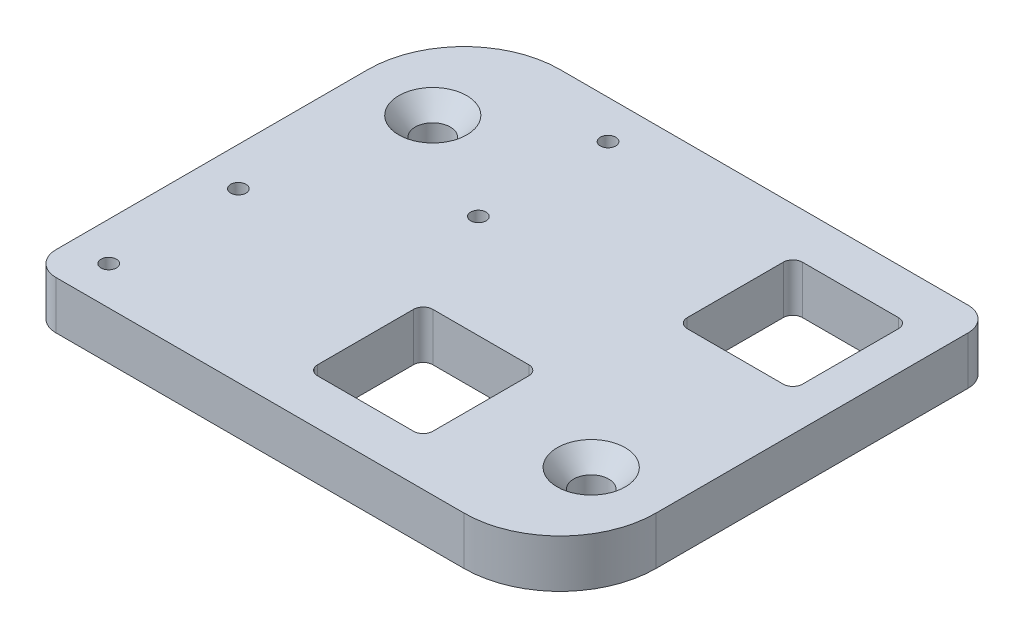
ISO-10303-21;
HEADER;
FILE_DESCRIPTION(('STEP AP214'),'2;1');
FILE_NAME('part.step','',(''),(''),'','','');
FILE_SCHEMA(('AUTOMOTIVE_DESIGN { 1 0 10303 214 1 1 1 1 }'));
ENDSEC;
DATA;
#1=APPLICATION_CONTEXT('core data for automotive mechanical design processes');
#2=APPLICATION_PROTOCOL_DEFINITION('international standard','automotive_design',2000,#1);
#3=PRODUCT_CONTEXT('',#1,'mechanical');
#4=PRODUCT('Part','Part','',(#3));
#5=PRODUCT_RELATED_PRODUCT_CATEGORY('part','',(#4));
#6=PRODUCT_DEFINITION_FORMATION('','',#4);
#7=PRODUCT_DEFINITION_CONTEXT('part definition',#1,'design');
#8=PRODUCT_DEFINITION('design','',#6,#7);
#9=PRODUCT_DEFINITION_SHAPE('','',#8);
#10=(LENGTH_UNIT() NAMED_UNIT(*) SI_UNIT(.MILLI.,.METRE.));
#11=(NAMED_UNIT(*) PLANE_ANGLE_UNIT() SI_UNIT($,.RADIAN.));
#12=(NAMED_UNIT(*) SI_UNIT($,.STERADIAN.) SOLID_ANGLE_UNIT());
#13=UNCERTAINTY_MEASURE_WITH_UNIT(LENGTH_MEASURE(1.E-05),#10,'distance_accuracy_value','');
#14=(GEOMETRIC_REPRESENTATION_CONTEXT(3) GLOBAL_UNCERTAINTY_ASSIGNED_CONTEXT((#13)) GLOBAL_UNIT_ASSIGNED_CONTEXT((#10,
#11,#12)) REPRESENTATION_CONTEXT('',''));
#15=CARTESIAN_POINT('',(0.,0.,0.));
#16=DIRECTION('',(0.,0.,1.));
#17=DIRECTION('',(1.,0.,0.));
#18=AXIS2_PLACEMENT_3D('',#15,#16,#17);
#19=CARTESIAN_POINT('',(-27.5,-5.,-45.));
#20=DIRECTION('',(-1.,0.,0.));
#21=DIRECTION('',(0.,0.,1.));
#22=AXIS2_PLACEMENT_3D('',#19,#20,#21);
#23=PLANE('',#22);
#24=DIRECTION('',(0.,0.,1.));
#25=VECTOR('',#24,1.);
#26=CARTESIAN_POINT('',(-27.5,-5.,-45.));
#27=LINE('',#26,#25);
#28=CARTESIAN_POINT('',(-27.5,-5.,-35.));
#29=VERTEX_POINT('',#28);
#30=CARTESIAN_POINT('',(-27.5,-5.,-2.50000000000002));
#31=VERTEX_POINT('',#30);
#32=EDGE_CURVE('E203',#29,#31,#27,.T.);
#33=ORIENTED_EDGE('',*,*,#32,.T.);
#34=DIRECTION('',(0.,1.,0.));
#35=VECTOR('',#34,1.);
#36=CARTESIAN_POINT('',(-27.5,-5.,-2.5));
#37=LINE('',#36,#35);
#38=CARTESIAN_POINT('',(-27.5,0.,-2.50000000000002));
#39=VERTEX_POINT('',#38);
#40=EDGE_CURVE('E236',#31,#39,#37,.T.);
#41=ORIENTED_EDGE('',*,*,#40,.T.);
#42=DIRECTION('',(0.,0.,1.));
#43=VECTOR('',#42,1.);
#44=CARTESIAN_POINT('',(-27.5,0.,-45.));
#45=LINE('',#44,#43);
#46=CARTESIAN_POINT('',(-27.5,0.,-35.));
#47=VERTEX_POINT('',#46);
#48=EDGE_CURVE('E399',#47,#39,#45,.T.);
#49=ORIENTED_EDGE('',*,*,#48,.F.);
#50=DIRECTION('',(0.,1.,0.));
#51=VECTOR('',#50,1.);
#52=CARTESIAN_POINT('',(-27.5,-5.,-35.));
#53=LINE('',#52,#51);
#54=EDGE_CURVE('E212',#47,#29,#53,.F.);
#55=ORIENTED_EDGE('',*,*,#54,.T.);
#56=EDGE_LOOP('',(#33,#41,#49,#55));
#57=FACE_BOUND('',#56,.T.);
#58=ADVANCED_FACE('F32',(#57),#23,.T.);
#59=CARTESIAN_POINT('',(-27.5,-5.,-45.));
#60=DIRECTION('',(0.,0.,-1.));
#61=DIRECTION('',(-1.,0.,0.));
#62=AXIS2_PLACEMENT_3D('',#59,#60,#61);
#63=PLANE('',#62);
#64=DIRECTION('',(-1.,0.,0.));
#65=VECTOR('',#64,1.);
#66=CARTESIAN_POINT('',(-27.5,0.,-45.));
#67=LINE('',#66,#65);
#68=CARTESIAN_POINT('',(25.,0.,-45.));
#69=VERTEX_POINT('',#68);
#70=CARTESIAN_POINT('',(-17.5,0.,-45.));
#71=VERTEX_POINT('',#70);
#72=EDGE_CURVE('E192',#69,#71,#67,.T.);
#73=ORIENTED_EDGE('',*,*,#72,.F.);
#74=DIRECTION('',(0.,1.,0.));
#75=VECTOR('',#74,1.);
#76=CARTESIAN_POINT('',(25.,-5.,-45.));
#77=LINE('',#76,#75);
#78=CARTESIAN_POINT('',(25.,-5.,-45.));
#79=VERTEX_POINT('',#78);
#80=EDGE_CURVE('E251',#69,#79,#77,.F.);
#81=ORIENTED_EDGE('',*,*,#80,.T.);
#82=DIRECTION('',(-1.,0.,0.));
#83=VECTOR('',#82,1.);
#84=CARTESIAN_POINT('',(-27.5,-5.,-45.));
#85=LINE('',#84,#83);
#86=CARTESIAN_POINT('',(-17.5,-5.,-45.));
#87=VERTEX_POINT('',#86);
#88=EDGE_CURVE('E217',#79,#87,#85,.T.);
#89=ORIENTED_EDGE('',*,*,#88,.T.);
#90=DIRECTION('',(0.,1.,0.));
#91=VECTOR('',#90,1.);
#92=CARTESIAN_POINT('',(-17.5,-5.,-45.));
#93=LINE('',#92,#91);
#94=EDGE_CURVE('E211',#87,#71,#93,.T.);
#95=ORIENTED_EDGE('',*,*,#94,.T.);
#96=EDGE_LOOP('',(#73,#81,#89,#95));
#97=FACE_BOUND('',#96,.T.);
#98=ADVANCED_FACE('F215',(#97),#63,.T.);
#99=CARTESIAN_POINT('',(27.5,-5.,-45.));
#100=DIRECTION('',(1.,0.,0.));
#101=DIRECTION('',(0.,0.,-1.));
#102=AXIS2_PLACEMENT_3D('',#99,#100,#101);
#103=PLANE('',#102);
#104=DIRECTION('',(0.,0.,-1.));
#105=VECTOR('',#104,1.);
#106=CARTESIAN_POINT('',(27.5,-5.,-45.));
#107=LINE('',#106,#105);
#108=CARTESIAN_POINT('',(27.5,-5.,-10.));
#109=VERTEX_POINT('',#108);
#110=CARTESIAN_POINT('',(27.5,-5.,-42.5));
#111=VERTEX_POINT('',#110);
#112=EDGE_CURVE('E221',#109,#111,#107,.T.);
#113=ORIENTED_EDGE('',*,*,#112,.T.);
#114=DIRECTION('',(0.,1.,0.));
#115=VECTOR('',#114,1.);
#116=CARTESIAN_POINT('',(27.5,-5.,-42.5));
#117=LINE('',#116,#115);
#118=CARTESIAN_POINT('',(27.5,0.,-42.5));
#119=VERTEX_POINT('',#118);
#120=EDGE_CURVE('E248',#111,#119,#117,.T.);
#121=ORIENTED_EDGE('',*,*,#120,.T.);
#122=DIRECTION('',(0.,0.,-1.));
#123=VECTOR('',#122,1.);
#124=CARTESIAN_POINT('',(27.5,0.,-45.));
#125=LINE('',#124,#123);
#126=CARTESIAN_POINT('',(27.5,0.,-10.));
#127=VERTEX_POINT('',#126);
#128=EDGE_CURVE('E204',#127,#119,#125,.T.);
#129=ORIENTED_EDGE('',*,*,#128,.F.);
#130=DIRECTION('',(0.,1.,0.));
#131=VECTOR('',#130,1.);
#132=CARTESIAN_POINT('',(27.5,-5.,-9.99999999999999));
#133=LINE('',#132,#131);
#134=EDGE_CURVE('E234',#127,#109,#133,.F.);
#135=ORIENTED_EDGE('',*,*,#134,.T.);
#136=EDGE_LOOP('',(#113,#121,#129,#135));
#137=FACE_BOUND('',#136,.T.);
#138=ADVANCED_FACE('F412',(#137),#103,.T.);
#139=CARTESIAN_POINT('',(-27.5,-5.,0.));
#140=DIRECTION('',(0.,0.,1.));
#141=DIRECTION('',(1.,0.,0.));
#142=AXIS2_PLACEMENT_3D('',#139,#140,#141);
#143=PLANE('',#142);
#144=DIRECTION('',(1.,0.,0.));
#145=VECTOR('',#144,1.);
#146=CARTESIAN_POINT('',(-27.5,0.,0.));
#147=LINE('',#146,#145);
#148=CARTESIAN_POINT('',(-25.,0.,0.));
#149=VERTEX_POINT('',#148);
#150=CARTESIAN_POINT('',(17.5,0.,0.));
#151=VERTEX_POINT('',#150);
#152=EDGE_CURVE('E407',#149,#151,#147,.T.);
#153=ORIENTED_EDGE('',*,*,#152,.F.);
#154=DIRECTION('',(0.,1.,0.));
#155=VECTOR('',#154,1.);
#156=CARTESIAN_POINT('',(-25.,-5.,0.));
#157=LINE('',#156,#155);
#158=CARTESIAN_POINT('',(-25.,-5.,0.));
#159=VERTEX_POINT('',#158);
#160=EDGE_CURVE('E242',#149,#159,#157,.F.);
#161=ORIENTED_EDGE('',*,*,#160,.T.);
#162=DIRECTION('',(1.,0.,0.));
#163=VECTOR('',#162,1.);
#164=CARTESIAN_POINT('',(-27.5,-5.,0.));
#165=LINE('',#164,#163);
#166=CARTESIAN_POINT('',(17.5,-5.,0.));
#167=VERTEX_POINT('',#166);
#168=EDGE_CURVE('E402',#159,#167,#165,.T.);
#169=ORIENTED_EDGE('',*,*,#168,.T.);
#170=DIRECTION('',(0.,1.,0.));
#171=VECTOR('',#170,1.);
#172=CARTESIAN_POINT('',(17.5,-5.,0.));
#173=LINE('',#172,#171);
#174=EDGE_CURVE('E231',#167,#151,#173,.T.);
#175=ORIENTED_EDGE('',*,*,#174,.T.);
#176=EDGE_LOOP('',(#153,#161,#169,#175));
#177=FACE_BOUND('',#176,.T.);
#178=ADVANCED_FACE('F434',(#177),#143,.T.);
#179=CARTESIAN_POINT('',(0.,-5.,0.));
#180=DIRECTION('',(0.,1.,0.));
#181=DIRECTION('',(0.,0.,1.));
#182=AXIS2_PLACEMENT_3D('',#179,#180,#181);
#183=PLANE('',#182);
#184=DIRECTION('',(0.,0.,-1.));
#185=VECTOR('',#184,1.);
#186=CARTESIAN_POINT('',(8.49999999999999,-5.,-16.75));
#187=LINE('',#186,#185);
#188=CARTESIAN_POINT('',(8.49999999999999,-5.,-5.75000000000001));
#189=VERTEX_POINT('',#188);
#190=CARTESIAN_POINT('',(8.49999999999999,-5.,-15.75));
#191=VERTEX_POINT('',#190);
#192=EDGE_CURVE('E511',#189,#191,#187,.T.);
#193=ORIENTED_EDGE('',*,*,#192,.T.);
#194=CARTESIAN_POINT('',(7.49999999999999,-5.,-15.75));
#195=DIRECTION('',(0.,1.,0.));
#196=DIRECTION('',(0.,0.,1.));
#197=AXIS2_PLACEMENT_3D('',#194,#195,#196);
#198=CIRCLE('',#197,1.);
#199=CARTESIAN_POINT('',(7.49999999999999,-5.,-16.75));
#200=VERTEX_POINT('',#199);
#201=EDGE_CURVE('E294',#191,#200,#198,.T.);
#202=ORIENTED_EDGE('',*,*,#201,.T.);
#203=DIRECTION('',(-1.,0.,0.));
#204=VECTOR('',#203,1.);
#205=CARTESIAN_POINT('',(-3.50000000000001,-5.,-16.75));
#206=LINE('',#205,#204);
#207=CARTESIAN_POINT('',(-2.50000000000001,-5.,-16.75));
#208=VERTEX_POINT('',#207);
#209=EDGE_CURVE('E360',#200,#208,#206,.T.);
#210=ORIENTED_EDGE('',*,*,#209,.T.);
#211=CARTESIAN_POINT('',(-2.50000000000001,-5.,-15.75));
#212=DIRECTION('',(0.,1.,0.));
#213=DIRECTION('',(0.,0.,1.));
#214=AXIS2_PLACEMENT_3D('',#211,#212,#213);
#215=CIRCLE('',#214,1.);
#216=CARTESIAN_POINT('',(-3.50000000000001,-5.,-15.75));
#217=VERTEX_POINT('',#216);
#218=EDGE_CURVE('E298',#208,#217,#215,.T.);
#219=ORIENTED_EDGE('',*,*,#218,.T.);
#220=DIRECTION('',(0.,0.,1.));
#221=VECTOR('',#220,1.);
#222=CARTESIAN_POINT('',(-3.50000000000001,-5.,-16.75));
#223=LINE('',#222,#221);
#224=CARTESIAN_POINT('',(-3.50000000000001,-5.,-5.75000000000001));
#225=VERTEX_POINT('',#224);
#226=EDGE_CURVE('E503',#217,#225,#223,.T.);
#227=ORIENTED_EDGE('',*,*,#226,.T.);
#228=CARTESIAN_POINT('',(-2.50000000000001,-5.,-5.75000000000001));
#229=DIRECTION('',(0.,1.,0.));
#230=DIRECTION('',(0.,0.,1.));
#231=AXIS2_PLACEMENT_3D('',#228,#229,#230);
#232=CIRCLE('',#231,1.);
#233=CARTESIAN_POINT('',(-2.50000000000001,-5.,-4.75000000000001));
#234=VERTEX_POINT('',#233);
#235=EDGE_CURVE('E302',#225,#234,#232,.T.);
#236=ORIENTED_EDGE('',*,*,#235,.T.);
#237=DIRECTION('',(1.,0.,0.));
#238=VECTOR('',#237,1.);
#239=CARTESIAN_POINT('',(-3.50000000000001,-5.,-4.75000000000001));
#240=LINE('',#239,#238);
#241=CARTESIAN_POINT('',(7.49999999999999,-5.,-4.75000000000001));
#242=VERTEX_POINT('',#241);
#243=EDGE_CURVE('E514',#234,#242,#240,.T.);
#244=ORIENTED_EDGE('',*,*,#243,.T.);
#245=CARTESIAN_POINT('',(7.49999999999999,-5.,-5.75000000000001));
#246=DIRECTION('',(0.,1.,0.));
#247=DIRECTION('',(0.,0.,1.));
#248=AXIS2_PLACEMENT_3D('',#245,#246,#247);
#249=CIRCLE('',#248,1.);
#250=EDGE_CURVE('E306',#242,#189,#249,.T.);
#251=ORIENTED_EDGE('',*,*,#250,.T.);
#252=EDGE_LOOP('',(#193,#202,#210,#219,#227,#236,#244,#251));
#253=FACE_BOUND('',#252,.T.);
#254=DIRECTION('',(0.,0.,-1.));
#255=VECTOR('',#254,1.);
#256=CARTESIAN_POINT('',(23.5,-5.,-40.25));
#257=LINE('',#256,#255);
#258=CARTESIAN_POINT('',(23.5,-5.,-29.25));
#259=VERTEX_POINT('',#258);
#260=CARTESIAN_POINT('',(23.5,-5.,-39.25));
#261=VERTEX_POINT('',#260);
#262=EDGE_CURVE('E340',#259,#261,#257,.T.);
#263=ORIENTED_EDGE('',*,*,#262,.T.);
#264=CARTESIAN_POINT('',(22.5,-5.,-39.25));
#265=DIRECTION('',(0.,1.,0.));
#266=DIRECTION('',(0.,0.,1.));
#267=AXIS2_PLACEMENT_3D('',#264,#265,#266);
#268=CIRCLE('',#267,1.);
#269=CARTESIAN_POINT('',(22.5,-5.,-40.25));
#270=VERTEX_POINT('',#269);
#271=EDGE_CURVE('E11',#261,#270,#268,.T.);
#272=ORIENTED_EDGE('',*,*,#271,.T.);
#273=DIRECTION('',(-1.,0.,0.));
#274=VECTOR('',#273,1.);
#275=CARTESIAN_POINT('',(11.5,-5.,-40.25));
#276=LINE('',#275,#274);
#277=CARTESIAN_POINT('',(12.5,-5.,-40.25));
#278=VERTEX_POINT('',#277);
#279=EDGE_CURVE('E337',#270,#278,#276,.T.);
#280=ORIENTED_EDGE('',*,*,#279,.T.);
#281=CARTESIAN_POINT('',(12.5,-5.,-39.25));
#282=DIRECTION('',(0.,1.,0.));
#283=DIRECTION('',(0.,0.,1.));
#284=AXIS2_PLACEMENT_3D('',#281,#282,#283);
#285=CIRCLE('',#284,1.);
#286=CARTESIAN_POINT('',(11.5,-5.,-39.25));
#287=VERTEX_POINT('',#286);
#288=EDGE_CURVE('E318',#278,#287,#285,.T.);
#289=ORIENTED_EDGE('',*,*,#288,.T.);
#290=DIRECTION('',(0.,0.,1.));
#291=VECTOR('',#290,1.);
#292=CARTESIAN_POINT('',(11.5,-5.,-40.25));
#293=LINE('',#292,#291);
#294=CARTESIAN_POINT('',(11.5,-5.,-29.25));
#295=VERTEX_POINT('',#294);
#296=EDGE_CURVE('E355',#287,#295,#293,.T.);
#297=ORIENTED_EDGE('',*,*,#296,.T.);
#298=CARTESIAN_POINT('',(12.5,-5.,-29.25));
#299=DIRECTION('',(0.,1.,0.));
#300=DIRECTION('',(0.,0.,1.));
#301=AXIS2_PLACEMENT_3D('',#298,#299,#300);
#302=CIRCLE('',#301,1.);
#303=CARTESIAN_POINT('',(12.5,-5.,-28.25));
#304=VERTEX_POINT('',#303);
#305=EDGE_CURVE('E314',#295,#304,#302,.T.);
#306=ORIENTED_EDGE('',*,*,#305,.T.);
#307=DIRECTION('',(1.,0.,0.));
#308=VECTOR('',#307,1.);
#309=CARTESIAN_POINT('',(11.5,-5.,-28.25));
#310=LINE('',#309,#308);
#311=CARTESIAN_POINT('',(22.5,-5.,-28.25));
#312=VERTEX_POINT('',#311);
#313=EDGE_CURVE('E345',#304,#312,#310,.T.);
#314=ORIENTED_EDGE('',*,*,#313,.T.);
#315=CARTESIAN_POINT('',(22.5,-5.,-29.25));
#316=DIRECTION('',(0.,1.,0.));
#317=DIRECTION('',(0.,0.,1.));
#318=AXIS2_PLACEMENT_3D('',#315,#316,#317);
#319=CIRCLE('',#318,1.);
#320=EDGE_CURVE('E310',#312,#259,#319,.T.);
#321=ORIENTED_EDGE('',*,*,#320,.T.);
#322=EDGE_LOOP('',(#263,#272,#280,#289,#297,#306,#314,#321));
#323=FACE_BOUND('',#322,.T.);
#324=CARTESIAN_POINT('',(-20.,-5.,-34.25));
#325=DIRECTION('',(0.,1.,0.));
#326=DIRECTION('',(0.,0.,1.));
#327=AXIS2_PLACEMENT_3D('',#324,#325,#326);
#328=CIRCLE('',#327,1.8288);
#329=CARTESIAN_POINT('',(-20.,-5.,-32.4212));
#330=VERTEX_POINT('',#329);
#331=EDGE_CURVE('E363',#330,#330,#328,.T.);
#332=ORIENTED_EDGE('',*,*,#331,.T.);
#333=EDGE_LOOP('',(#332));
#334=FACE_BOUND('',#333,.T.);
#335=CARTESIAN_POINT('',(20.,-5.,-10.75));
#336=DIRECTION('',(0.,1.,0.));
#337=DIRECTION('',(0.,0.,1.));
#338=AXIS2_PLACEMENT_3D('',#335,#336,#337);
#339=CIRCLE('',#338,1.8288);
#340=CARTESIAN_POINT('',(20.,-5.,-8.9212));
#341=VERTEX_POINT('',#340);
#342=EDGE_CURVE('E372',#341,#341,#339,.T.);
#343=ORIENTED_EDGE('',*,*,#342,.T.);
#344=EDGE_LOOP('',(#343));
#345=FACE_BOUND('',#344,.T.);
#346=CARTESIAN_POINT('',(-23.5,-5.,-4.));
#347=DIRECTION('',(0.,1.,0.));
#348=DIRECTION('',(0.,0.,1.));
#349=AXIS2_PLACEMENT_3D('',#346,#347,#348);
#350=CIRCLE('',#349,0.799999999999999);
#351=CARTESIAN_POINT('',(-23.5,-5.,-3.2));
#352=VERTEX_POINT('',#351);
#353=EDGE_CURVE('E378',#352,#352,#350,.T.);
#354=ORIENTED_EDGE('',*,*,#353,.T.);
#355=EDGE_LOOP('',(#354));
#356=FACE_BOUND('',#355,.T.);
#357=CARTESIAN_POINT('',(-23.5,-5.,-17.5));
#358=DIRECTION('',(0.,1.,0.));
#359=DIRECTION('',(0.,0.,1.));
#360=AXIS2_PLACEMENT_3D('',#357,#358,#359);
#361=CIRCLE('',#360,0.799999999999999);
#362=CARTESIAN_POINT('',(-23.5,-5.,-16.7));
#363=VERTEX_POINT('',#362);
#364=EDGE_CURVE('E384',#363,#363,#361,.T.);
#365=ORIENTED_EDGE('',*,*,#364,.T.);
#366=EDGE_LOOP('',(#365));
#367=FACE_BOUND('',#366,.T.);
#368=CARTESIAN_POINT('',(-8.5,-5.,-27.5));
#369=DIRECTION('',(0.,1.,0.));
#370=DIRECTION('',(0.,0.,1.));
#371=AXIS2_PLACEMENT_3D('',#368,#369,#370);
#372=CIRCLE('',#371,0.799999999999999);
#373=CARTESIAN_POINT('',(-8.5,-5.,-26.7));
#374=VERTEX_POINT('',#373);
#375=EDGE_CURVE('E390',#374,#374,#372,.T.);
#376=ORIENTED_EDGE('',*,*,#375,.T.);
#377=EDGE_LOOP('',(#376));
#378=FACE_BOUND('',#377,.T.);
#379=CARTESIAN_POINT('',(-8.5,-5.,-41.));
#380=DIRECTION('',(0.,1.,0.));
#381=DIRECTION('',(0.,0.,1.));
#382=AXIS2_PLACEMENT_3D('',#379,#380,#381);
#383=CIRCLE('',#382,0.799999999999999);
#384=CARTESIAN_POINT('',(-8.5,-5.,-40.2));
#385=VERTEX_POINT('',#384);
#386=EDGE_CURVE('E396',#385,#385,#383,.T.);
#387=ORIENTED_EDGE('',*,*,#386,.T.);
#388=EDGE_LOOP('',(#387));
#389=FACE_BOUND('',#388,.T.);
#390=ORIENTED_EDGE('',*,*,#168,.F.);
#391=CARTESIAN_POINT('',(-25.,-5.,-2.5));
#392=DIRECTION('',(0.,1.,0.));
#393=DIRECTION('',(0.,0.,1.));
#394=AXIS2_PLACEMENT_3D('',#391,#392,#393);
#395=CIRCLE('',#394,2.5);
#396=EDGE_CURVE('E246',#159,#31,#395,.F.);
#397=ORIENTED_EDGE('',*,*,#396,.T.);
#398=ORIENTED_EDGE('',*,*,#32,.F.);
#399=CARTESIAN_POINT('',(-17.5,-5.,-35.));
#400=DIRECTION('',(0.,1.,0.));
#401=DIRECTION('',(0.,0.,1.));
#402=AXIS2_PLACEMENT_3D('',#399,#400,#401);
#403=CIRCLE('',#402,10.);
#404=EDGE_CURVE('E229',#29,#87,#403,.F.);
#405=ORIENTED_EDGE('',*,*,#404,.T.);
#406=ORIENTED_EDGE('',*,*,#88,.F.);
#407=CARTESIAN_POINT('',(25.,-5.,-42.5));
#408=DIRECTION('',(0.,1.,0.));
#409=DIRECTION('',(0.,0.,1.));
#410=AXIS2_PLACEMENT_3D('',#407,#408,#409);
#411=CIRCLE('',#410,2.5);
#412=EDGE_CURVE('E244',#79,#111,#411,.F.);
#413=ORIENTED_EDGE('',*,*,#412,.T.);
#414=ORIENTED_EDGE('',*,*,#112,.F.);
#415=CARTESIAN_POINT('',(17.5,-5.,-10.));
#416=DIRECTION('',(0.,1.,0.));
#417=DIRECTION('',(0.,0.,1.));
#418=AXIS2_PLACEMENT_3D('',#415,#416,#417);
#419=CIRCLE('',#418,10.);
#420=EDGE_CURVE('E226',#109,#167,#419,.F.);
#421=ORIENTED_EDGE('',*,*,#420,.T.);
#422=EDGE_LOOP('',(#390,#397,#398,#405,#406,#413,#414,#421));
#423=FACE_BOUND('',#422,.T.);
#424=ADVANCED_FACE('F421',(#253,#323,#334,#345,#356,#367,#378,#389,#423),#183,.F.);
#425=CARTESIAN_POINT('',(0.,0.,0.));
#426=DIRECTION('',(0.,1.,0.));
#427=DIRECTION('',(0.,0.,1.));
#428=AXIS2_PLACEMENT_3D('',#425,#426,#427);
#429=PLANE('',#428);
#430=DIRECTION('',(0.,0.,1.));
#431=VECTOR('',#430,1.);
#432=CARTESIAN_POINT('',(-3.50000000000001,0.,-16.75));
#433=LINE('',#432,#431);
#434=CARTESIAN_POINT('',(-3.50000000000001,0.,-15.75));
#435=VERTEX_POINT('',#434);
#436=CARTESIAN_POINT('',(-3.50000000000001,0.,-5.75000000000001));
#437=VERTEX_POINT('',#436);
#438=EDGE_CURVE('E339',#435,#437,#433,.T.);
#439=ORIENTED_EDGE('',*,*,#438,.F.);
#440=CARTESIAN_POINT('',(-2.50000000000001,0.,-15.75));
#441=DIRECTION('',(0.,1.,0.));
#442=DIRECTION('',(0.,0.,1.));
#443=AXIS2_PLACEMENT_3D('',#440,#441,#442);
#444=CIRCLE('',#443,1.);
#445=CARTESIAN_POINT('',(-2.50000000000001,0.,-16.75));
#446=VERTEX_POINT('',#445);
#447=EDGE_CURVE('E296',#435,#446,#444,.F.);
#448=ORIENTED_EDGE('',*,*,#447,.T.);
#449=DIRECTION('',(-1.,0.,0.));
#450=VECTOR('',#449,1.);
#451=CARTESIAN_POINT('',(-3.50000000000001,0.,-16.75));
#452=LINE('',#451,#450);
#453=CARTESIAN_POINT('',(7.49999999999999,0.,-16.75));
#454=VERTEX_POINT('',#453);
#455=EDGE_CURVE('E500',#454,#446,#452,.T.);
#456=ORIENTED_EDGE('',*,*,#455,.F.);
#457=CARTESIAN_POINT('',(7.49999999999999,0.,-15.75));
#458=DIRECTION('',(0.,1.,0.));
#459=DIRECTION('',(0.,0.,1.));
#460=AXIS2_PLACEMENT_3D('',#457,#458,#459);
#461=CIRCLE('',#460,1.);
#462=CARTESIAN_POINT('',(8.49999999999999,0.,-15.75));
#463=VERTEX_POINT('',#462);
#464=EDGE_CURVE('E292',#454,#463,#461,.F.);
#465=ORIENTED_EDGE('',*,*,#464,.T.);
#466=DIRECTION('',(0.,0.,-1.));
#467=VECTOR('',#466,1.);
#468=CARTESIAN_POINT('',(8.49999999999999,0.,-16.75));
#469=LINE('',#468,#467);
#470=CARTESIAN_POINT('',(8.49999999999999,0.,-5.75000000000001));
#471=VERTEX_POINT('',#470);
#472=EDGE_CURVE('E504',#471,#463,#469,.T.);
#473=ORIENTED_EDGE('',*,*,#472,.F.);
#474=CARTESIAN_POINT('',(7.49999999999999,0.,-5.75000000000001));
#475=DIRECTION('',(0.,1.,0.));
#476=DIRECTION('',(0.,0.,1.));
#477=AXIS2_PLACEMENT_3D('',#474,#475,#476);
#478=CIRCLE('',#477,1.);
#479=CARTESIAN_POINT('',(7.49999999999999,0.,-4.75000000000001));
#480=VERTEX_POINT('',#479);
#481=EDGE_CURVE('E304',#471,#480,#478,.F.);
#482=ORIENTED_EDGE('',*,*,#481,.T.);
#483=DIRECTION('',(1.,0.,0.));
#484=VECTOR('',#483,1.);
#485=CARTESIAN_POINT('',(-3.50000000000001,0.,-4.75000000000001));
#486=LINE('',#485,#484);
#487=CARTESIAN_POINT('',(-2.50000000000001,0.,-4.75000000000001));
#488=VERTEX_POINT('',#487);
#489=EDGE_CURVE('E343',#488,#480,#486,.T.);
#490=ORIENTED_EDGE('',*,*,#489,.F.);
#491=CARTESIAN_POINT('',(-2.50000000000001,0.,-5.75000000000001));
#492=DIRECTION('',(0.,1.,0.));
#493=DIRECTION('',(0.,0.,1.));
#494=AXIS2_PLACEMENT_3D('',#491,#492,#493);
#495=CIRCLE('',#494,1.);
#496=EDGE_CURVE('E300',#488,#437,#495,.F.);
#497=ORIENTED_EDGE('',*,*,#496,.T.);
#498=EDGE_LOOP('',(#439,#448,#456,#465,#473,#482,#490,#497));
#499=FACE_BOUND('',#498,.T.);
#500=DIRECTION('',(0.,0.,1.));
#501=VECTOR('',#500,1.);
#502=CARTESIAN_POINT('',(11.5,0.,-40.25));
#503=LINE('',#502,#501);
#504=CARTESIAN_POINT('',(11.5,0.,-39.25));
#505=VERTEX_POINT('',#504);
#506=CARTESIAN_POINT('',(11.5,0.,-29.25));
#507=VERTEX_POINT('',#506);
#508=EDGE_CURVE('E349',#505,#507,#503,.T.);
#509=ORIENTED_EDGE('',*,*,#508,.F.);
#510=CARTESIAN_POINT('',(12.5,0.,-39.25));
#511=DIRECTION('',(0.,1.,0.));
#512=DIRECTION('',(0.,0.,1.));
#513=AXIS2_PLACEMENT_3D('',#510,#511,#512);
#514=CIRCLE('',#513,1.);
#515=CARTESIAN_POINT('',(12.5,0.,-40.25));
#516=VERTEX_POINT('',#515);
#517=EDGE_CURVE('E316',#505,#516,#514,.F.);
#518=ORIENTED_EDGE('',*,*,#517,.T.);
#519=DIRECTION('',(-1.,0.,0.));
#520=VECTOR('',#519,1.);
#521=CARTESIAN_POINT('',(11.5,0.,-40.25));
#522=LINE('',#521,#520);
#523=CARTESIAN_POINT('',(22.5,0.,-40.25));
#524=VERTEX_POINT('',#523);
#525=EDGE_CURVE('E326',#524,#516,#522,.T.);
#526=ORIENTED_EDGE('',*,*,#525,.F.);
#527=CARTESIAN_POINT('',(22.5,0.,-39.25));
#528=DIRECTION('',(0.,1.,0.));
#529=DIRECTION('',(0.,0.,1.));
#530=AXIS2_PLACEMENT_3D('',#527,#528,#529);
#531=CIRCLE('',#530,1.);
#532=CARTESIAN_POINT('',(23.5,0.,-39.25));
#533=VERTEX_POINT('',#532);
#534=EDGE_CURVE('E40',#524,#533,#531,.F.);
#535=ORIENTED_EDGE('',*,*,#534,.T.);
#536=DIRECTION('',(0.,0.,-1.));
#537=VECTOR('',#536,1.);
#538=CARTESIAN_POINT('',(23.5,0.,-40.25));
#539=LINE('',#538,#537);
#540=CARTESIAN_POINT('',(23.5,0.,-29.25));
#541=VERTEX_POINT('',#540);
#542=EDGE_CURVE('E325',#541,#533,#539,.T.);
#543=ORIENTED_EDGE('',*,*,#542,.F.);
#544=CARTESIAN_POINT('',(22.5,0.,-29.25));
#545=DIRECTION('',(0.,1.,0.));
#546=DIRECTION('',(0.,0.,1.));
#547=AXIS2_PLACEMENT_3D('',#544,#545,#546);
#548=CIRCLE('',#547,1.);
#549=CARTESIAN_POINT('',(22.5,0.,-28.25));
#550=VERTEX_POINT('',#549);
#551=EDGE_CURVE('E308',#541,#550,#548,.F.);
#552=ORIENTED_EDGE('',*,*,#551,.T.);
#553=DIRECTION('',(1.,0.,0.));
#554=VECTOR('',#553,1.);
#555=CARTESIAN_POINT('',(11.5,0.,-28.25));
#556=LINE('',#555,#554);
#557=CARTESIAN_POINT('',(12.5,0.,-28.25));
#558=VERTEX_POINT('',#557);
#559=EDGE_CURVE('E334',#558,#550,#556,.T.);
#560=ORIENTED_EDGE('',*,*,#559,.F.);
#561=CARTESIAN_POINT('',(12.5,0.,-29.25));
#562=DIRECTION('',(0.,1.,0.));
#563=DIRECTION('',(0.,0.,1.));
#564=AXIS2_PLACEMENT_3D('',#561,#562,#563);
#565=CIRCLE('',#564,1.);
#566=EDGE_CURVE('E312',#558,#507,#565,.F.);
#567=ORIENTED_EDGE('',*,*,#566,.T.);
#568=EDGE_LOOP('',(#509,#518,#526,#535,#543,#552,#560,#567));
#569=FACE_BOUND('',#568,.T.);
#570=CARTESIAN_POINT('',(-20.,0.,-34.25));
#571=DIRECTION('',(0.,1.,0.));
#572=DIRECTION('',(0.,0.,1.));
#573=AXIS2_PLACEMENT_3D('',#570,#571,#572);
#574=CIRCLE('',#573,3.5433);
#575=CARTESIAN_POINT('',(-20.,0.,-30.7067));
#576=VERTEX_POINT('',#575);
#577=EDGE_CURVE('E356',#576,#576,#574,.T.);
#578=ORIENTED_EDGE('',*,*,#577,.F.);
#579=EDGE_LOOP('',(#578));
#580=FACE_BOUND('',#579,.T.);
#581=CARTESIAN_POINT('',(20.,0.,-10.75));
#582=DIRECTION('',(0.,1.,0.));
#583=DIRECTION('',(0.,0.,1.));
#584=AXIS2_PLACEMENT_3D('',#581,#582,#583);
#585=CIRCLE('',#584,3.5433);
#586=CARTESIAN_POINT('',(20.,0.,-7.2067));
#587=VERTEX_POINT('',#586);
#588=EDGE_CURVE('E366',#587,#587,#585,.T.);
#589=ORIENTED_EDGE('',*,*,#588,.F.);
#590=EDGE_LOOP('',(#589));
#591=FACE_BOUND('',#590,.T.);
#592=CARTESIAN_POINT('',(-23.5,0.,-4.));
#593=DIRECTION('',(0.,1.,0.));
#594=DIRECTION('',(0.,0.,1.));
#595=AXIS2_PLACEMENT_3D('',#592,#593,#594);
#596=CIRCLE('',#595,0.799999999999999);
#597=CARTESIAN_POINT('',(-23.5,0.,-3.2));
#598=VERTEX_POINT('',#597);
#599=EDGE_CURVE('E375',#598,#598,#596,.T.);
#600=ORIENTED_EDGE('',*,*,#599,.F.);
#601=EDGE_LOOP('',(#600));
#602=FACE_BOUND('',#601,.T.);
#603=CARTESIAN_POINT('',(-23.5,0.,-17.5));
#604=DIRECTION('',(0.,1.,0.));
#605=DIRECTION('',(0.,0.,1.));
#606=AXIS2_PLACEMENT_3D('',#603,#604,#605);
#607=CIRCLE('',#606,0.799999999999999);
#608=CARTESIAN_POINT('',(-23.5,0.,-16.7));
#609=VERTEX_POINT('',#608);
#610=EDGE_CURVE('E381',#609,#609,#607,.T.);
#611=ORIENTED_EDGE('',*,*,#610,.F.);
#612=EDGE_LOOP('',(#611));
#613=FACE_BOUND('',#612,.T.);
#614=CARTESIAN_POINT('',(-8.5,0.,-27.5));
#615=DIRECTION('',(0.,1.,0.));
#616=DIRECTION('',(0.,0.,1.));
#617=AXIS2_PLACEMENT_3D('',#614,#615,#616);
#618=CIRCLE('',#617,0.799999999999999);
#619=CARTESIAN_POINT('',(-8.5,0.,-26.7));
#620=VERTEX_POINT('',#619);
#621=EDGE_CURVE('E387',#620,#620,#618,.T.);
#622=ORIENTED_EDGE('',*,*,#621,.F.);
#623=EDGE_LOOP('',(#622));
#624=FACE_BOUND('',#623,.T.);
#625=CARTESIAN_POINT('',(-8.5,0.,-41.));
#626=DIRECTION('',(0.,1.,0.));
#627=DIRECTION('',(0.,0.,1.));
#628=AXIS2_PLACEMENT_3D('',#625,#626,#627);
#629=CIRCLE('',#628,0.799999999999999);
#630=CARTESIAN_POINT('',(-8.5,0.,-40.2));
#631=VERTEX_POINT('',#630);
#632=EDGE_CURVE('E393',#631,#631,#629,.T.);
#633=ORIENTED_EDGE('',*,*,#632,.F.);
#634=EDGE_LOOP('',(#633));
#635=FACE_BOUND('',#634,.T.);
#636=ORIENTED_EDGE('',*,*,#48,.T.);
#637=CARTESIAN_POINT('',(-25.,0.,-2.5));
#638=DIRECTION('',(0.,1.,0.));
#639=DIRECTION('',(0.,0.,1.));
#640=AXIS2_PLACEMENT_3D('',#637,#638,#639);
#641=CIRCLE('',#640,2.5);
#642=EDGE_CURVE('E240',#39,#149,#641,.T.);
#643=ORIENTED_EDGE('',*,*,#642,.T.);
#644=ORIENTED_EDGE('',*,*,#152,.T.);
#645=CARTESIAN_POINT('',(17.5,0.,-10.));
#646=DIRECTION('',(0.,1.,0.));
#647=DIRECTION('',(0.,0.,1.));
#648=AXIS2_PLACEMENT_3D('',#645,#646,#647);
#649=CIRCLE('',#648,10.);
#650=EDGE_CURVE('E213',#151,#127,#649,.T.);
#651=ORIENTED_EDGE('',*,*,#650,.T.);
#652=ORIENTED_EDGE('',*,*,#128,.T.);
#653=CARTESIAN_POINT('',(25.,0.,-42.5));
#654=DIRECTION('',(0.,1.,0.));
#655=DIRECTION('',(0.,0.,1.));
#656=AXIS2_PLACEMENT_3D('',#653,#654,#655);
#657=CIRCLE('',#656,2.5);
#658=EDGE_CURVE('E199',#119,#69,#657,.T.);
#659=ORIENTED_EDGE('',*,*,#658,.T.);
#660=ORIENTED_EDGE('',*,*,#72,.T.);
#661=CARTESIAN_POINT('',(-17.5,0.,-35.));
#662=DIRECTION('',(0.,1.,0.));
#663=DIRECTION('',(0.,0.,1.));
#664=AXIS2_PLACEMENT_3D('',#661,#662,#663);
#665=CIRCLE('',#664,10.);
#666=EDGE_CURVE('E196',#71,#47,#665,.T.);
#667=ORIENTED_EDGE('',*,*,#666,.T.);
#668=EDGE_LOOP('',(#636,#643,#644,#651,#652,#659,#660,#667));
#669=FACE_BOUND('',#668,.T.);
#670=ADVANCED_FACE('F195',(#499,#569,#580,#591,#602,#613,#624,#635,#669),#429,.T.);
#671=CARTESIAN_POINT('',(-8.5,0.,-41.));
#672=DIRECTION('',(0.,1.,0.));
#673=DIRECTION('',(0.,0.,1.));
#674=AXIS2_PLACEMENT_3D('',#671,#672,#673);
#675=CYLINDRICAL_SURFACE('',#674,0.799999999999999);
#676=ORIENTED_EDGE('',*,*,#386,.F.);
#677=EDGE_LOOP('',(#676));
#678=FACE_BOUND('',#677,.T.);
#679=ORIENTED_EDGE('',*,*,#632,.T.);
#680=EDGE_LOOP('',(#679));
#681=FACE_BOUND('',#680,.T.);
#682=ADVANCED_FACE('F592',(#678,#681),#675,.F.);
#683=CARTESIAN_POINT('',(-8.5,0.,-27.5));
#684=DIRECTION('',(0.,1.,0.));
#685=DIRECTION('',(0.,0.,1.));
#686=AXIS2_PLACEMENT_3D('',#683,#684,#685);
#687=CYLINDRICAL_SURFACE('',#686,0.799999999999999);
#688=ORIENTED_EDGE('',*,*,#375,.F.);
#689=EDGE_LOOP('',(#688));
#690=FACE_BOUND('',#689,.T.);
#691=ORIENTED_EDGE('',*,*,#621,.T.);
#692=EDGE_LOOP('',(#691));
#693=FACE_BOUND('',#692,.T.);
#694=ADVANCED_FACE('F588',(#690,#693),#687,.F.);
#695=CARTESIAN_POINT('',(-23.5,0.,-17.5));
#696=DIRECTION('',(0.,1.,0.));
#697=DIRECTION('',(0.,0.,1.));
#698=AXIS2_PLACEMENT_3D('',#695,#696,#697);
#699=CYLINDRICAL_SURFACE('',#698,0.799999999999999);
#700=ORIENTED_EDGE('',*,*,#364,.F.);
#701=EDGE_LOOP('',(#700));
#702=FACE_BOUND('',#701,.T.);
#703=ORIENTED_EDGE('',*,*,#610,.T.);
#704=EDGE_LOOP('',(#703));
#705=FACE_BOUND('',#704,.T.);
#706=ADVANCED_FACE('F584',(#702,#705),#699,.F.);
#707=CARTESIAN_POINT('',(-23.5,0.,-4.));
#708=DIRECTION('',(0.,1.,0.));
#709=DIRECTION('',(0.,0.,1.));
#710=AXIS2_PLACEMENT_3D('',#707,#708,#709);
#711=CYLINDRICAL_SURFACE('',#710,0.799999999999999);
#712=ORIENTED_EDGE('',*,*,#353,.F.);
#713=EDGE_LOOP('',(#712));
#714=FACE_BOUND('',#713,.T.);
#715=ORIENTED_EDGE('',*,*,#599,.T.);
#716=EDGE_LOOP('',(#715));
#717=FACE_BOUND('',#716,.T.);
#718=ADVANCED_FACE('F580',(#714,#717),#711,.F.);
#719=CARTESIAN_POINT('',(20.,0.,-10.75));
#720=DIRECTION('',(0.,1.,0.));
#721=DIRECTION('',(0.,0.,1.));
#722=AXIS2_PLACEMENT_3D('',#719,#720,#721);
#723=CYLINDRICAL_SURFACE('',#722,1.8288);
#724=ORIENTED_EDGE('',*,*,#342,.F.);
#725=EDGE_LOOP('',(#724));
#726=FACE_BOUND('',#725,.T.);
#727=CARTESIAN_POINT('',(20.,-1.97230663418042,-10.75));
#728=DIRECTION('',(0.,1.,0.));
#729=DIRECTION('',(0.,0.,1.));
#730=AXIS2_PLACEMENT_3D('',#727,#728,#729);
#731=CIRCLE('',#730,1.8288);
#732=CARTESIAN_POINT('',(20.,-1.97230663418042,-8.9212));
#733=VERTEX_POINT('',#732);
#734=EDGE_CURVE('E369',#733,#733,#731,.T.);
#735=ORIENTED_EDGE('',*,*,#734,.T.);
#736=EDGE_LOOP('',(#735));
#737=FACE_BOUND('',#736,.T.);
#738=ADVANCED_FACE('F576',(#726,#737),#723,.F.);
#739=CARTESIAN_POINT('',(20.,0.,-10.75));
#740=DIRECTION('',(0.,1.,0.));
#741=DIRECTION('',(0.,0.,1.));
#742=AXIS2_PLACEMENT_3D('',#739,#740,#741);
#743=CONICAL_SURFACE('',#742,3.5433,0.715584993317675);
#744=ORIENTED_EDGE('',*,*,#734,.F.);
#745=EDGE_LOOP('',(#744));
#746=FACE_BOUND('',#745,.T.);
#747=ORIENTED_EDGE('',*,*,#588,.T.);
#748=EDGE_LOOP('',(#747));
#749=FACE_BOUND('',#748,.T.);
#750=ADVANCED_FACE('F572',(#746,#749),#743,.F.);
#751=CARTESIAN_POINT('',(-20.,0.,-34.25));
#752=DIRECTION('',(0.,1.,0.));
#753=DIRECTION('',(0.,0.,1.));
#754=AXIS2_PLACEMENT_3D('',#751,#752,#753);
#755=CYLINDRICAL_SURFACE('',#754,1.8288);
#756=ORIENTED_EDGE('',*,*,#331,.F.);
#757=EDGE_LOOP('',(#756));
#758=FACE_BOUND('',#757,.T.);
#759=CARTESIAN_POINT('',(-20.,-1.97230663418042,-34.25));
#760=DIRECTION('',(0.,1.,0.));
#761=DIRECTION('',(0.,0.,1.));
#762=AXIS2_PLACEMENT_3D('',#759,#760,#761);
#763=CIRCLE('',#762,1.8288);
#764=CARTESIAN_POINT('',(-20.,-1.97230663418042,-32.4212));
#765=VERTEX_POINT('',#764);
#766=EDGE_CURVE('E359',#765,#765,#763,.T.);
#767=ORIENTED_EDGE('',*,*,#766,.T.);
#768=EDGE_LOOP('',(#767));
#769=FACE_BOUND('',#768,.T.);
#770=ADVANCED_FACE('F568',(#758,#769),#755,.F.);
#771=CARTESIAN_POINT('',(-20.,0.,-34.25));
#772=DIRECTION('',(0.,1.,0.));
#773=DIRECTION('',(0.,0.,1.));
#774=AXIS2_PLACEMENT_3D('',#771,#772,#773);
#775=CONICAL_SURFACE('',#774,3.5433,0.715584993317675);
#776=ORIENTED_EDGE('',*,*,#766,.F.);
#777=EDGE_LOOP('',(#776));
#778=FACE_BOUND('',#777,.T.);
#779=ORIENTED_EDGE('',*,*,#577,.T.);
#780=EDGE_LOOP('',(#779));
#781=FACE_BOUND('',#780,.T.);
#782=ADVANCED_FACE('F565',(#778,#781),#775,.F.);
#783=CARTESIAN_POINT('',(11.5,-5.,-40.25));
#784=DIRECTION('',(-1.,0.,0.));
#785=DIRECTION('',(0.,0.,1.));
#786=AXIS2_PLACEMENT_3D('',#783,#784,#785);
#787=PLANE('',#786);
#788=ORIENTED_EDGE('',*,*,#508,.T.);
#789=DIRECTION('',(0.,1.,0.));
#790=VECTOR('',#789,1.);
#791=CARTESIAN_POINT('',(11.5,-5.,-29.25));
#792=LINE('',#791,#790);
#793=EDGE_CURVE('E286',#507,#295,#792,.F.);
#794=ORIENTED_EDGE('',*,*,#793,.T.);
#795=ORIENTED_EDGE('',*,*,#296,.F.);
#796=DIRECTION('',(0.,1.,0.));
#797=VECTOR('',#796,1.);
#798=CARTESIAN_POINT('',(11.5,0.,-39.25));
#799=LINE('',#798,#797);
#800=EDGE_CURVE('E283',#287,#505,#799,.T.);
#801=ORIENTED_EDGE('',*,*,#800,.T.);
#802=EDGE_LOOP('',(#788,#794,#795,#801));
#803=FACE_BOUND('',#802,.T.);
#804=ADVANCED_FACE('F495',(#803),#787,.F.);
#805=CARTESIAN_POINT('',(11.5,-5.,-40.25));
#806=DIRECTION('',(0.,0.,-1.));
#807=DIRECTION('',(-1.,0.,0.));
#808=AXIS2_PLACEMENT_3D('',#805,#806,#807);
#809=PLANE('',#808);
#810=ORIENTED_EDGE('',*,*,#525,.T.);
#811=DIRECTION('',(0.,1.,0.));
#812=VECTOR('',#811,1.);
#813=CARTESIAN_POINT('',(12.5,-5.,-40.25));
#814=LINE('',#813,#812);
#815=EDGE_CURVE('E47',#516,#278,#814,.F.);
#816=ORIENTED_EDGE('',*,*,#815,.T.);
#817=ORIENTED_EDGE('',*,*,#279,.F.);
#818=DIRECTION('',(0.,1.,0.));
#819=VECTOR('',#818,1.);
#820=CARTESIAN_POINT('',(22.5,0.,-40.25));
#821=LINE('',#820,#819);
#822=EDGE_CURVE('E288',#270,#524,#821,.T.);
#823=ORIENTED_EDGE('',*,*,#822,.T.);
#824=EDGE_LOOP('',(#810,#816,#817,#823));
#825=FACE_BOUND('',#824,.T.);
#826=ADVANCED_FACE('F336',(#825),#809,.F.);
#827=CARTESIAN_POINT('',(23.5,-5.,-40.25));
#828=DIRECTION('',(1.,0.,0.));
#829=DIRECTION('',(0.,0.,-1.));
#830=AXIS2_PLACEMENT_3D('',#827,#828,#829);
#831=PLANE('',#830);
#832=ORIENTED_EDGE('',*,*,#262,.F.);
#833=DIRECTION('',(0.,1.,0.));
#834=VECTOR('',#833,1.);
#835=CARTESIAN_POINT('',(23.5,0.,-29.25));
#836=LINE('',#835,#834);
#837=EDGE_CURVE('E275',#259,#541,#836,.T.);
#838=ORIENTED_EDGE('',*,*,#837,.T.);
#839=ORIENTED_EDGE('',*,*,#542,.T.);
#840=DIRECTION('',(0.,1.,0.));
#841=VECTOR('',#840,1.);
#842=CARTESIAN_POINT('',(23.5,-5.,-39.25));
#843=LINE('',#842,#841);
#844=EDGE_CURVE('E273',#533,#261,#843,.F.);
#845=ORIENTED_EDGE('',*,*,#844,.T.);
#846=EDGE_LOOP('',(#832,#838,#839,#845));
#847=FACE_BOUND('',#846,.T.);
#848=ADVANCED_FACE('F332',(#847),#831,.F.);
#849=CARTESIAN_POINT('',(11.5,-5.,-28.25));
#850=DIRECTION('',(0.,0.,1.));
#851=DIRECTION('',(1.,0.,0.));
#852=AXIS2_PLACEMENT_3D('',#849,#850,#851);
#853=PLANE('',#852);
#854=ORIENTED_EDGE('',*,*,#559,.T.);
#855=DIRECTION('',(0.,1.,0.));
#856=VECTOR('',#855,1.);
#857=CARTESIAN_POINT('',(22.5,-5.,-28.25));
#858=LINE('',#857,#856);
#859=EDGE_CURVE('E281',#550,#312,#858,.F.);
#860=ORIENTED_EDGE('',*,*,#859,.T.);
#861=ORIENTED_EDGE('',*,*,#313,.F.);
#862=DIRECTION('',(0.,1.,0.));
#863=VECTOR('',#862,1.);
#864=CARTESIAN_POINT('',(12.5,0.,-28.25));
#865=LINE('',#864,#863);
#866=EDGE_CURVE('E278',#304,#558,#865,.T.);
#867=ORIENTED_EDGE('',*,*,#866,.T.);
#868=EDGE_LOOP('',(#854,#860,#861,#867));
#869=FACE_BOUND('',#868,.T.);
#870=ADVANCED_FACE('F547',(#869),#853,.F.);
#871=CARTESIAN_POINT('',(-3.50000000000001,-5.,-16.75));
#872=DIRECTION('',(-1.,0.,0.));
#873=DIRECTION('',(0.,0.,1.));
#874=AXIS2_PLACEMENT_3D('',#871,#872,#873);
#875=PLANE('',#874);
#876=ORIENTED_EDGE('',*,*,#226,.F.);
#877=DIRECTION('',(0.,1.,0.));
#878=VECTOR('',#877,1.);
#879=CARTESIAN_POINT('',(-3.50000000000001,0.,-15.75));
#880=LINE('',#879,#878);
#881=EDGE_CURVE('E265',#217,#435,#880,.T.);
#882=ORIENTED_EDGE('',*,*,#881,.T.);
#883=ORIENTED_EDGE('',*,*,#438,.T.);
#884=DIRECTION('',(0.,1.,0.));
#885=VECTOR('',#884,1.);
#886=CARTESIAN_POINT('',(-3.50000000000001,-5.,-5.75000000000001));
#887=LINE('',#886,#885);
#888=EDGE_CURVE('E263',#437,#225,#887,.F.);
#889=ORIENTED_EDGE('',*,*,#888,.T.);
#890=EDGE_LOOP('',(#876,#882,#883,#889));
#891=FACE_BOUND('',#890,.T.);
#892=ADVANCED_FACE('F545',(#891),#875,.F.);
#893=CARTESIAN_POINT('',(-3.50000000000001,-5.,-16.75));
#894=DIRECTION('',(0.,0.,-1.));
#895=DIRECTION('',(-1.,0.,0.));
#896=AXIS2_PLACEMENT_3D('',#893,#894,#895);
#897=PLANE('',#896);
#898=ORIENTED_EDGE('',*,*,#209,.F.);
#899=DIRECTION('',(0.,1.,0.));
#900=VECTOR('',#899,1.);
#901=CARTESIAN_POINT('',(7.49999999999999,0.,-16.75));
#902=LINE('',#901,#900);
#903=EDGE_CURVE('E255',#200,#454,#902,.T.);
#904=ORIENTED_EDGE('',*,*,#903,.T.);
#905=ORIENTED_EDGE('',*,*,#455,.T.);
#906=DIRECTION('',(0.,1.,0.));
#907=VECTOR('',#906,1.);
#908=CARTESIAN_POINT('',(-2.50000000000001,-5.,-16.75));
#909=LINE('',#908,#907);
#910=EDGE_CURVE('E253',#446,#208,#909,.F.);
#911=ORIENTED_EDGE('',*,*,#910,.T.);
#912=EDGE_LOOP('',(#898,#904,#905,#911));
#913=FACE_BOUND('',#912,.T.);
#914=ADVANCED_FACE('F543',(#913),#897,.F.);
#915=CARTESIAN_POINT('',(8.49999999999999,-5.,-16.75));
#916=DIRECTION('',(1.,0.,0.));
#917=DIRECTION('',(0.,0.,-1.));
#918=AXIS2_PLACEMENT_3D('',#915,#916,#917);
#919=PLANE('',#918);
#920=ORIENTED_EDGE('',*,*,#472,.T.);
#921=DIRECTION('',(0.,1.,0.));
#922=VECTOR('',#921,1.);
#923=CARTESIAN_POINT('',(8.49999999999999,-5.,-15.75));
#924=LINE('',#923,#922);
#925=EDGE_CURVE('E261',#463,#191,#924,.F.);
#926=ORIENTED_EDGE('',*,*,#925,.T.);
#927=ORIENTED_EDGE('',*,*,#192,.F.);
#928=DIRECTION('',(0.,1.,0.));
#929=VECTOR('',#928,1.);
#930=CARTESIAN_POINT('',(8.49999999999999,0.,-5.75000000000001));
#931=LINE('',#930,#929);
#932=EDGE_CURVE('E258',#189,#471,#931,.T.);
#933=ORIENTED_EDGE('',*,*,#932,.T.);
#934=EDGE_LOOP('',(#920,#926,#927,#933));
#935=FACE_BOUND('',#934,.T.);
#936=ADVANCED_FACE('F536',(#935),#919,.F.);
#937=CARTESIAN_POINT('',(-3.50000000000001,-5.,-4.75000000000001));
#938=DIRECTION('',(0.,0.,1.));
#939=DIRECTION('',(1.,0.,0.));
#940=AXIS2_PLACEMENT_3D('',#937,#938,#939);
#941=PLANE('',#940);
#942=ORIENTED_EDGE('',*,*,#243,.F.);
#943=DIRECTION('',(0.,1.,0.));
#944=VECTOR('',#943,1.);
#945=CARTESIAN_POINT('',(-2.50000000000001,0.,-4.75000000000001));
#946=LINE('',#945,#944);
#947=EDGE_CURVE('E270',#234,#488,#946,.T.);
#948=ORIENTED_EDGE('',*,*,#947,.T.);
#949=ORIENTED_EDGE('',*,*,#489,.T.);
#950=DIRECTION('',(0.,1.,0.));
#951=VECTOR('',#950,1.);
#952=CARTESIAN_POINT('',(7.49999999999999,-5.,-4.75000000000001));
#953=LINE('',#952,#951);
#954=EDGE_CURVE('E268',#480,#242,#953,.F.);
#955=ORIENTED_EDGE('',*,*,#954,.T.);
#956=EDGE_LOOP('',(#942,#948,#949,#955));
#957=FACE_BOUND('',#956,.T.);
#958=ADVANCED_FACE('F453',(#957),#941,.F.);
#959=CARTESIAN_POINT('',(-17.5,-5.,-35.));
#960=DIRECTION('',(0.,1.,0.));
#961=DIRECTION('',(0.,0.,1.));
#962=AXIS2_PLACEMENT_3D('',#959,#960,#961);
#963=CYLINDRICAL_SURFACE('',#962,10.);
#964=ORIENTED_EDGE('',*,*,#404,.F.);
#965=ORIENTED_EDGE('',*,*,#54,.F.);
#966=ORIENTED_EDGE('',*,*,#666,.F.);
#967=ORIENTED_EDGE('',*,*,#94,.F.);
#968=EDGE_LOOP('',(#964,#965,#966,#967));
#969=FACE_BOUND('',#968,.T.);
#970=ADVANCED_FACE('F210',(#969),#963,.T.);
#971=CARTESIAN_POINT('',(17.5,-5.,-10.));
#972=DIRECTION('',(0.,1.,0.));
#973=DIRECTION('',(0.,0.,1.));
#974=AXIS2_PLACEMENT_3D('',#971,#972,#973);
#975=CYLINDRICAL_SURFACE('',#974,10.);
#976=ORIENTED_EDGE('',*,*,#420,.F.);
#977=ORIENTED_EDGE('',*,*,#134,.F.);
#978=ORIENTED_EDGE('',*,*,#650,.F.);
#979=ORIENTED_EDGE('',*,*,#174,.F.);
#980=EDGE_LOOP('',(#976,#977,#978,#979));
#981=FACE_BOUND('',#980,.T.);
#982=ADVANCED_FACE('F417',(#981),#975,.T.);
#983=CARTESIAN_POINT('',(-25.,-5.,-2.5));
#984=DIRECTION('',(0.,1.,0.));
#985=DIRECTION('',(0.,0.,1.));
#986=AXIS2_PLACEMENT_3D('',#983,#984,#985);
#987=CYLINDRICAL_SURFACE('',#986,2.5);
#988=ORIENTED_EDGE('',*,*,#396,.F.);
#989=ORIENTED_EDGE('',*,*,#160,.F.);
#990=ORIENTED_EDGE('',*,*,#642,.F.);
#991=ORIENTED_EDGE('',*,*,#40,.F.);
#992=EDGE_LOOP('',(#988,#989,#990,#991));
#993=FACE_BOUND('',#992,.T.);
#994=ADVANCED_FACE('F430',(#993),#987,.T.);
#995=CARTESIAN_POINT('',(25.,-5.,-42.5));
#996=DIRECTION('',(0.,1.,0.));
#997=DIRECTION('',(0.,0.,1.));
#998=AXIS2_PLACEMENT_3D('',#995,#996,#997);
#999=CYLINDRICAL_SURFACE('',#998,2.5);
#1000=ORIENTED_EDGE('',*,*,#412,.F.);
#1001=ORIENTED_EDGE('',*,*,#80,.F.);
#1002=ORIENTED_EDGE('',*,*,#658,.F.);
#1003=ORIENTED_EDGE('',*,*,#120,.F.);
#1004=EDGE_LOOP('',(#1000,#1001,#1002,#1003));
#1005=FACE_BOUND('',#1004,.T.);
#1006=ADVANCED_FACE('F425',(#1005),#999,.T.);
#1007=CARTESIAN_POINT('',(7.49999999999999,-5.,-15.75));
#1008=DIRECTION('',(0.,-1.,0.));
#1009=DIRECTION('',(0.,0.,-1.));
#1010=AXIS2_PLACEMENT_3D('',#1007,#1008,#1009);
#1011=CYLINDRICAL_SURFACE('',#1010,1.);
#1012=ORIENTED_EDGE('',*,*,#201,.F.);
#1013=ORIENTED_EDGE('',*,*,#925,.F.);
#1014=ORIENTED_EDGE('',*,*,#464,.F.);
#1015=ORIENTED_EDGE('',*,*,#903,.F.);
#1016=EDGE_LOOP('',(#1012,#1013,#1014,#1015));
#1017=FACE_BOUND('',#1016,.T.);
#1018=ADVANCED_FACE('F460',(#1017),#1011,.F.);
#1019=CARTESIAN_POINT('',(-2.50000000000001,-5.,-15.75));
#1020=DIRECTION('',(0.,-1.,0.));
#1021=DIRECTION('',(0.,0.,-1.));
#1022=AXIS2_PLACEMENT_3D('',#1019,#1020,#1021);
#1023=CYLINDRICAL_SURFACE('',#1022,1.);
#1024=ORIENTED_EDGE('',*,*,#218,.F.);
#1025=ORIENTED_EDGE('',*,*,#910,.F.);
#1026=ORIENTED_EDGE('',*,*,#447,.F.);
#1027=ORIENTED_EDGE('',*,*,#881,.F.);
#1028=EDGE_LOOP('',(#1024,#1025,#1026,#1027));
#1029=FACE_BOUND('',#1028,.T.);
#1030=ADVANCED_FACE('F463',(#1029),#1023,.F.);
#1031=CARTESIAN_POINT('',(-2.50000000000001,-5.,-5.75000000000001));
#1032=DIRECTION('',(0.,-1.,0.));
#1033=DIRECTION('',(0.,0.,-1.));
#1034=AXIS2_PLACEMENT_3D('',#1031,#1032,#1033);
#1035=CYLINDRICAL_SURFACE('',#1034,1.);
#1036=ORIENTED_EDGE('',*,*,#235,.F.);
#1037=ORIENTED_EDGE('',*,*,#888,.F.);
#1038=ORIENTED_EDGE('',*,*,#496,.F.);
#1039=ORIENTED_EDGE('',*,*,#947,.F.);
#1040=EDGE_LOOP('',(#1036,#1037,#1038,#1039));
#1041=FACE_BOUND('',#1040,.T.);
#1042=ADVANCED_FACE('F467',(#1041),#1035,.F.);
#1043=CARTESIAN_POINT('',(7.49999999999999,-5.,-5.75000000000001));
#1044=DIRECTION('',(0.,-1.,0.));
#1045=DIRECTION('',(0.,0.,-1.));
#1046=AXIS2_PLACEMENT_3D('',#1043,#1044,#1045);
#1047=CYLINDRICAL_SURFACE('',#1046,1.);
#1048=ORIENTED_EDGE('',*,*,#250,.F.);
#1049=ORIENTED_EDGE('',*,*,#954,.F.);
#1050=ORIENTED_EDGE('',*,*,#481,.F.);
#1051=ORIENTED_EDGE('',*,*,#932,.F.);
#1052=EDGE_LOOP('',(#1048,#1049,#1050,#1051));
#1053=FACE_BOUND('',#1052,.T.);
#1054=ADVANCED_FACE('F471',(#1053),#1047,.F.);
#1055=CARTESIAN_POINT('',(22.5,-5.,-29.25));
#1056=DIRECTION('',(0.,-1.,0.));
#1057=DIRECTION('',(0.,0.,-1.));
#1058=AXIS2_PLACEMENT_3D('',#1055,#1056,#1057);
#1059=CYLINDRICAL_SURFACE('',#1058,1.);
#1060=ORIENTED_EDGE('',*,*,#320,.F.);
#1061=ORIENTED_EDGE('',*,*,#859,.F.);
#1062=ORIENTED_EDGE('',*,*,#551,.F.);
#1063=ORIENTED_EDGE('',*,*,#837,.F.);
#1064=EDGE_LOOP('',(#1060,#1061,#1062,#1063));
#1065=FACE_BOUND('',#1064,.T.);
#1066=ADVANCED_FACE('F475',(#1065),#1059,.F.);
#1067=CARTESIAN_POINT('',(12.5,-5.,-29.25));
#1068=DIRECTION('',(0.,-1.,0.));
#1069=DIRECTION('',(0.,0.,-1.));
#1070=AXIS2_PLACEMENT_3D('',#1067,#1068,#1069);
#1071=CYLINDRICAL_SURFACE('',#1070,1.);
#1072=ORIENTED_EDGE('',*,*,#305,.F.);
#1073=ORIENTED_EDGE('',*,*,#793,.F.);
#1074=ORIENTED_EDGE('',*,*,#566,.F.);
#1075=ORIENTED_EDGE('',*,*,#866,.F.);
#1076=EDGE_LOOP('',(#1072,#1073,#1074,#1075));
#1077=FACE_BOUND('',#1076,.T.);
#1078=ADVANCED_FACE('F479',(#1077),#1071,.F.);
#1079=CARTESIAN_POINT('',(12.5,-5.,-39.25));
#1080=DIRECTION('',(0.,-1.,0.));
#1081=DIRECTION('',(0.,0.,-1.));
#1082=AXIS2_PLACEMENT_3D('',#1079,#1080,#1081);
#1083=CYLINDRICAL_SURFACE('',#1082,1.);
#1084=ORIENTED_EDGE('',*,*,#288,.F.);
#1085=ORIENTED_EDGE('',*,*,#815,.F.);
#1086=ORIENTED_EDGE('',*,*,#517,.F.);
#1087=ORIENTED_EDGE('',*,*,#800,.F.);
#1088=EDGE_LOOP('',(#1084,#1085,#1086,#1087));
#1089=FACE_BOUND('',#1088,.T.);
#1090=ADVANCED_FACE('F482',(#1089),#1083,.F.);
#1091=CARTESIAN_POINT('',(22.5,-5.,-39.25));
#1092=DIRECTION('',(0.,-1.,0.));
#1093=DIRECTION('',(0.,0.,-1.));
#1094=AXIS2_PLACEMENT_3D('',#1091,#1092,#1093);
#1095=CYLINDRICAL_SURFACE('',#1094,1.);
#1096=ORIENTED_EDGE('',*,*,#271,.F.);
#1097=ORIENTED_EDGE('',*,*,#844,.F.);
#1098=ORIENTED_EDGE('',*,*,#534,.F.);
#1099=ORIENTED_EDGE('',*,*,#822,.F.);
#1100=EDGE_LOOP('',(#1096,#1097,#1098,#1099));
#1101=FACE_BOUND('',#1100,.T.);
#1102=ADVANCED_FACE('F34',(#1101),#1095,.F.);
#1103=CLOSED_SHELL('',(#58,#98,#138,#178,#424,#670,#682,#694,#706,#718,#738,#750,#770,#782,#804,
#826,#848,#870,#892,#914,#936,#958,#970,#982,#994,#1006,#1018,#1030,#1042,#1054,#1066,#1078,
#1090,#1102));
#1104=MANIFOLD_SOLID_BREP('B2',#1103);
#1105=ADVANCED_BREP_SHAPE_REPRESENTATION('',(#18,#1104),#14);
#1106=SHAPE_DEFINITION_REPRESENTATION(#9,#1105);
ENDSEC;
END-ISO-10303-21;
